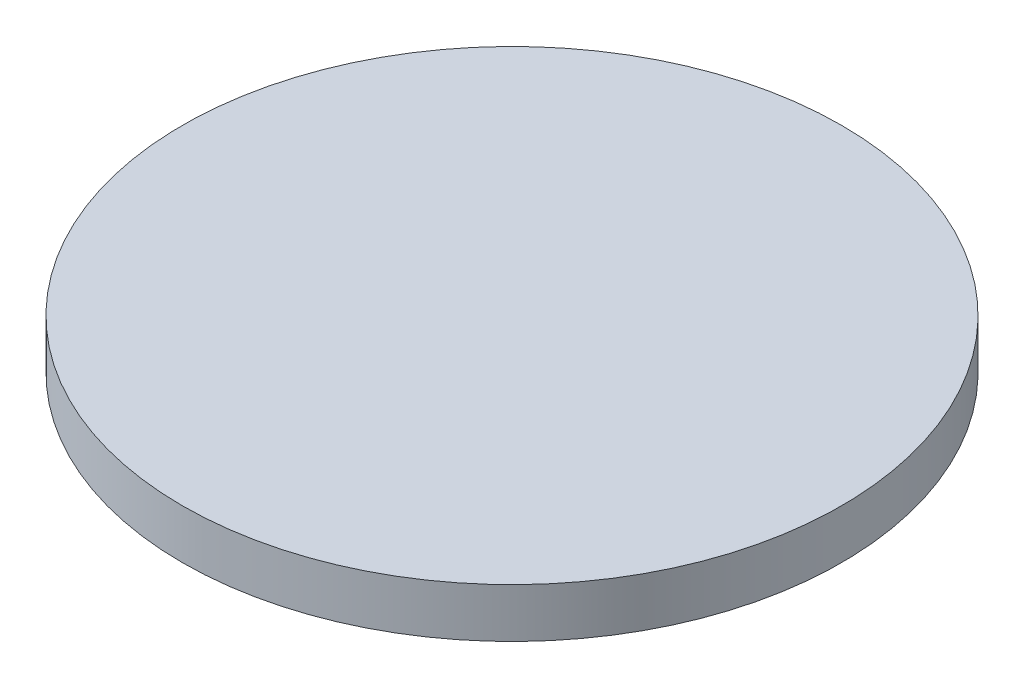
ISO-10303-21;
HEADER;
FILE_DESCRIPTION(('STEP AP214'),'2;1');
FILE_NAME('part.step','',(''),(''),'','','');
FILE_SCHEMA(('AUTOMOTIVE_DESIGN { 1 0 10303 214 1 1 1 1 }'));
ENDSEC;
DATA;
#1=APPLICATION_CONTEXT('core data for automotive mechanical design processes');
#2=APPLICATION_PROTOCOL_DEFINITION('international standard','automotive_design',2000,#1);
#3=PRODUCT_CONTEXT('',#1,'mechanical');
#4=PRODUCT('Part','Part','',(#3));
#5=PRODUCT_RELATED_PRODUCT_CATEGORY('part','',(#4));
#6=PRODUCT_DEFINITION_FORMATION('','',#4);
#7=PRODUCT_DEFINITION_CONTEXT('part definition',#1,'design');
#8=PRODUCT_DEFINITION('design','',#6,#7);
#9=PRODUCT_DEFINITION_SHAPE('','',#8);
#10=(LENGTH_UNIT() NAMED_UNIT(*) SI_UNIT(.MILLI.,.METRE.));
#11=(NAMED_UNIT(*) PLANE_ANGLE_UNIT() SI_UNIT($,.RADIAN.));
#12=(NAMED_UNIT(*) SI_UNIT($,.STERADIAN.) SOLID_ANGLE_UNIT());
#13=UNCERTAINTY_MEASURE_WITH_UNIT(LENGTH_MEASURE(1.E-05),#10,'distance_accuracy_value','');
#14=(GEOMETRIC_REPRESENTATION_CONTEXT(3) GLOBAL_UNCERTAINTY_ASSIGNED_CONTEXT((#13)) GLOBAL_UNIT_ASSIGNED_CONTEXT((#10,
#11,#12)) REPRESENTATION_CONTEXT('',''));
#15=CARTESIAN_POINT('',(0.,0.,0.));
#16=DIRECTION('',(0.,0.,1.));
#17=DIRECTION('',(1.,0.,0.));
#18=AXIS2_PLACEMENT_3D('',#15,#16,#17);
#19=CARTESIAN_POINT('',(0.,3.03784,0.));
#20=DIRECTION('',(0.,-1.,0.));
#21=DIRECTION('',(0.,0.,-1.));
#22=AXIS2_PLACEMENT_3D('',#19,#20,#21);
#23=CYLINDRICAL_SURFACE('',#22,20.32);
#24=CARTESIAN_POINT('',(0.,3.03784,0.));
#25=DIRECTION('',(0.,1.,0.));
#26=DIRECTION('',(0.,0.,1.));
#27=AXIS2_PLACEMENT_3D('',#24,#25,#26);
#28=CIRCLE('',#27,20.32);
#29=CARTESIAN_POINT('',(0.,3.03784,20.32));
#30=VERTEX_POINT('',#29);
#31=EDGE_CURVE('E10',#30,#30,#28,.T.);
#32=ORIENTED_EDGE('',*,*,#31,.F.);
#33=EDGE_LOOP('',(#32));
#34=FACE_BOUND('',#33,.T.);
#35=CARTESIAN_POINT('',(0.,0.,0.));
#36=DIRECTION('',(0.,1.,0.));
#37=DIRECTION('',(0.,0.,1.));
#38=AXIS2_PLACEMENT_3D('',#35,#36,#37);
#39=CIRCLE('',#38,20.32);
#40=CARTESIAN_POINT('',(0.,0.,20.32));
#41=VERTEX_POINT('',#40);
#42=EDGE_CURVE('E42',#41,#41,#39,.T.);
#43=ORIENTED_EDGE('',*,*,#42,.T.);
#44=EDGE_LOOP('',(#43));
#45=FACE_BOUND('',#44,.T.);
#46=ADVANCED_FACE('F39',(#34,#45),#23,.T.);
#47=CARTESIAN_POINT('',(0.,3.03784,0.));
#48=DIRECTION('',(0.,1.,0.));
#49=DIRECTION('',(0.,0.,1.));
#50=AXIS2_PLACEMENT_3D('',#47,#48,#49);
#51=PLANE('',#50);
#52=ORIENTED_EDGE('',*,*,#31,.T.);
#53=EDGE_LOOP('',(#52));
#54=FACE_BOUND('',#53,.T.);
#55=ADVANCED_FACE('F54',(#54),#51,.T.);
#56=CARTESIAN_POINT('',(0.,0.,0.));
#57=DIRECTION('',(0.,1.,0.));
#58=DIRECTION('',(0.,0.,1.));
#59=AXIS2_PLACEMENT_3D('',#56,#57,#58);
#60=PLANE('',#59);
#61=ORIENTED_EDGE('',*,*,#42,.F.);
#62=EDGE_LOOP('',(#61));
#63=FACE_BOUND('',#62,.T.);
#64=ADVANCED_FACE('F52',(#63),#60,.F.);
#65=CLOSED_SHELL('',(#46,#55,#64));
#66=MANIFOLD_SOLID_BREP('B2',#65);
#67=ADVANCED_BREP_SHAPE_REPRESENTATION('',(#18,#66),#14);
#68=SHAPE_DEFINITION_REPRESENTATION(#9,#67);
ENDSEC;
END-ISO-10303-21;
